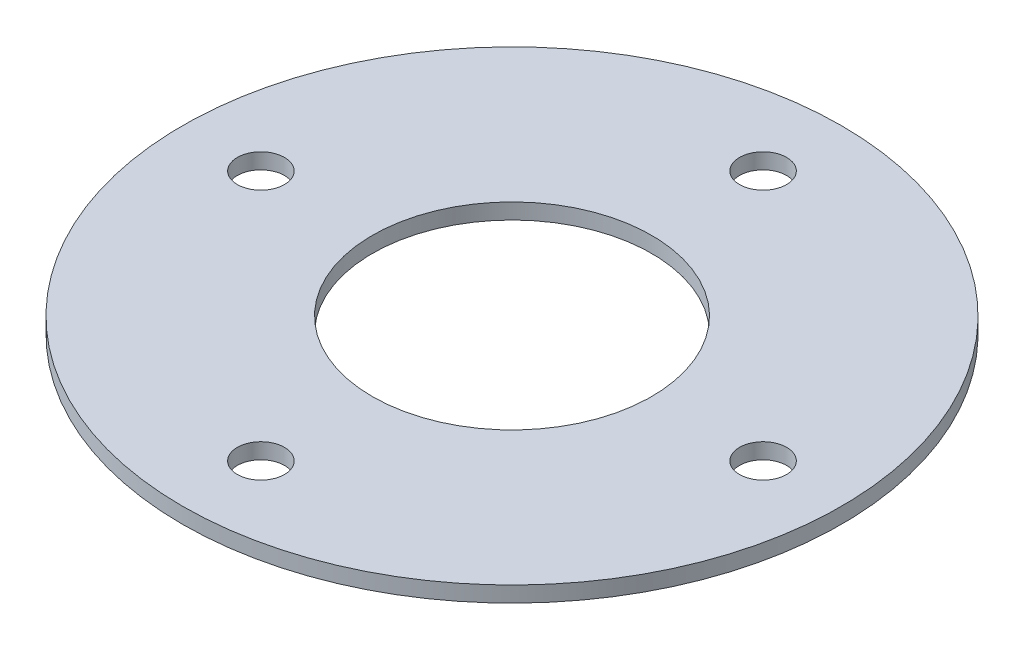
ISO-10303-21;
HEADER;
FILE_DESCRIPTION(('STEP AP214'),'2;1');
FILE_NAME('part.step','',(''),(''),'','','');
FILE_SCHEMA(('AUTOMOTIVE_DESIGN { 1 0 10303 214 1 1 1 1 }'));
ENDSEC;
DATA;
#1=APPLICATION_CONTEXT('core data for automotive mechanical design processes');
#2=APPLICATION_PROTOCOL_DEFINITION('international standard','automotive_design',2000,#1);
#3=PRODUCT_CONTEXT('',#1,'mechanical');
#4=PRODUCT('Part','Part','',(#3));
#5=PRODUCT_RELATED_PRODUCT_CATEGORY('part','',(#4));
#6=PRODUCT_DEFINITION_FORMATION('','',#4);
#7=PRODUCT_DEFINITION_CONTEXT('part definition',#1,'design');
#8=PRODUCT_DEFINITION('design','',#6,#7);
#9=PRODUCT_DEFINITION_SHAPE('','',#8);
#10=(LENGTH_UNIT() NAMED_UNIT(*) SI_UNIT(.MILLI.,.METRE.));
#11=(NAMED_UNIT(*) PLANE_ANGLE_UNIT() SI_UNIT($,.RADIAN.));
#12=(NAMED_UNIT(*) SI_UNIT($,.STERADIAN.) SOLID_ANGLE_UNIT());
#13=UNCERTAINTY_MEASURE_WITH_UNIT(LENGTH_MEASURE(1.E-05),#10,'distance_accuracy_value','');
#14=(GEOMETRIC_REPRESENTATION_CONTEXT(3) GLOBAL_UNCERTAINTY_ASSIGNED_CONTEXT((#13)) GLOBAL_UNIT_ASSIGNED_CONTEXT((#10,
#11,#12)) REPRESENTATION_CONTEXT('',''));
#15=CARTESIAN_POINT('',(0.,0.,0.));
#16=DIRECTION('',(0.,0.,1.));
#17=DIRECTION('',(1.,0.,0.));
#18=AXIS2_PLACEMENT_3D('',#15,#16,#17);
#19=CARTESIAN_POINT('',(0.,1.,0.));
#20=DIRECTION('',(0.,1.,0.));
#21=DIRECTION('',(0.,0.,1.));
#22=AXIS2_PLACEMENT_3D('',#19,#20,#21);
#23=PLANE('',#22);
#24=CARTESIAN_POINT('',(2.16898612446061E-13,1.,15.9999999999992));
#25=DIRECTION('',(0.,1.,0.));
#26=DIRECTION('',(0.,0.,1.));
#27=AXIS2_PLACEMENT_3D('',#24,#25,#26);
#28=CIRCLE('',#27,1.50000000000054);
#29=CARTESIAN_POINT('',(2.16898612446061E-13,1.,17.4999999999998));
#30=VERTEX_POINT('',#29);
#31=EDGE_CURVE('E60',#30,#30,#28,.T.);
#32=ORIENTED_EDGE('',*,*,#31,.F.);
#33=EDGE_LOOP('',(#32));
#34=FACE_BOUND('',#33,.T.);
#35=CARTESIAN_POINT('',(0.,1.,-16.));
#36=DIRECTION('',(0.,1.,0.));
#37=DIRECTION('',(0.,0.,1.));
#38=AXIS2_PLACEMENT_3D('',#35,#36,#37);
#39=CIRCLE('',#38,1.5);
#40=CARTESIAN_POINT('',(0.,1.,-14.5));
#41=VERTEX_POINT('',#40);
#42=EDGE_CURVE('E48',#41,#41,#39,.T.);
#43=ORIENTED_EDGE('',*,*,#42,.F.);
#44=EDGE_LOOP('',(#43));
#45=FACE_BOUND('',#44,.T.);
#46=CARTESIAN_POINT('',(0.,1.,0.));
#47=DIRECTION('',(0.,1.,0.));
#48=DIRECTION('',(0.,0.,1.));
#49=AXIS2_PLACEMENT_3D('',#46,#47,#48);
#50=CIRCLE('',#49,21.);
#51=CARTESIAN_POINT('',(0.,1.,21.));
#52=VERTEX_POINT('',#51);
#53=EDGE_CURVE('E10',#52,#52,#50,.T.);
#54=ORIENTED_EDGE('',*,*,#53,.T.);
#55=EDGE_LOOP('',(#54));
#56=FACE_BOUND('',#55,.T.);
#57=CARTESIAN_POINT('',(0.,1.,0.));
#58=DIRECTION('',(0.,1.,0.));
#59=DIRECTION('',(0.,0.,1.));
#60=AXIS2_PLACEMENT_3D('',#57,#58,#59);
#61=CIRCLE('',#60,8.9);
#62=CARTESIAN_POINT('',(0.,1.,8.9));
#63=VERTEX_POINT('',#62);
#64=EDGE_CURVE('E43',#63,#63,#61,.T.);
#65=ORIENTED_EDGE('',*,*,#64,.F.);
#66=EDGE_LOOP('',(#65));
#67=FACE_BOUND('',#66,.T.);
#68=CARTESIAN_POINT('',(15.9999999999997,1.,-4.83579257706417E-13));
#69=DIRECTION('',(0.,1.,0.));
#70=DIRECTION('',(0.,0.,1.));
#71=AXIS2_PLACEMENT_3D('',#68,#69,#70);
#72=CIRCLE('',#71,1.5000000000006);
#73=CARTESIAN_POINT('',(15.9999999999997,1.,1.50000000000011));
#74=VERTEX_POINT('',#73);
#75=EDGE_CURVE('E54',#74,#74,#72,.T.);
#76=ORIENTED_EDGE('',*,*,#75,.F.);
#77=EDGE_LOOP('',(#76));
#78=FACE_BOUND('',#77,.T.);
#79=CARTESIAN_POINT('',(-15.9999999999995,1.,-2.70800742940835E-13));
#80=DIRECTION('',(0.,1.,0.));
#81=DIRECTION('',(0.,0.,1.));
#82=AXIS2_PLACEMENT_3D('',#79,#80,#81);
#83=CIRCLE('',#82,1.50000000000004);
#84=CARTESIAN_POINT('',(-15.9999999999995,1.,1.49999999999977));
#85=VERTEX_POINT('',#84);
#86=EDGE_CURVE('E66',#85,#85,#83,.T.);
#87=ORIENTED_EDGE('',*,*,#86,.F.);
#88=EDGE_LOOP('',(#87));
#89=FACE_BOUND('',#88,.T.);
#90=ADVANCED_FACE('F32',(#34,#45,#56,#67,#78,#89),#23,.T.);
#91=CARTESIAN_POINT('',(0.,0.,0.));
#92=DIRECTION('',(0.,1.,0.));
#93=DIRECTION('',(0.,0.,1.));
#94=AXIS2_PLACEMENT_3D('',#91,#92,#93);
#95=PLANE('',#94);
#96=CARTESIAN_POINT('',(0.,0.,0.));
#97=DIRECTION('',(0.,1.,0.));
#98=DIRECTION('',(0.,0.,1.));
#99=AXIS2_PLACEMENT_3D('',#96,#97,#98);
#100=CIRCLE('',#99,21.);
#101=CARTESIAN_POINT('',(0.,0.,21.));
#102=VERTEX_POINT('',#101);
#103=EDGE_CURVE('E36',#102,#102,#100,.T.);
#104=ORIENTED_EDGE('',*,*,#103,.F.);
#105=EDGE_LOOP('',(#104));
#106=FACE_BOUND('',#105,.T.);
#107=CARTESIAN_POINT('',(0.,0.,0.));
#108=DIRECTION('',(0.,1.,0.));
#109=DIRECTION('',(0.,0.,1.));
#110=AXIS2_PLACEMENT_3D('',#107,#108,#109);
#111=CIRCLE('',#110,8.9);
#112=CARTESIAN_POINT('',(0.,0.,8.9));
#113=VERTEX_POINT('',#112);
#114=EDGE_CURVE('E45',#113,#113,#111,.T.);
#115=ORIENTED_EDGE('',*,*,#114,.T.);
#116=EDGE_LOOP('',(#115));
#117=FACE_BOUND('',#116,.T.);
#118=CARTESIAN_POINT('',(0.,0.,-16.));
#119=DIRECTION('',(0.,1.,0.));
#120=DIRECTION('',(0.,0.,1.));
#121=AXIS2_PLACEMENT_3D('',#118,#119,#120);
#122=CIRCLE('',#121,1.5);
#123=CARTESIAN_POINT('',(0.,0.,-14.5));
#124=VERTEX_POINT('',#123);
#125=EDGE_CURVE('E51',#124,#124,#122,.T.);
#126=ORIENTED_EDGE('',*,*,#125,.T.);
#127=EDGE_LOOP('',(#126));
#128=FACE_BOUND('',#127,.T.);
#129=CARTESIAN_POINT('',(15.9999999999997,0.,-4.83579257706417E-13));
#130=DIRECTION('',(0.,1.,0.));
#131=DIRECTION('',(0.,0.,1.));
#132=AXIS2_PLACEMENT_3D('',#129,#130,#131);
#133=CIRCLE('',#132,1.5000000000006);
#134=CARTESIAN_POINT('',(15.9999999999997,0.,1.50000000000011));
#135=VERTEX_POINT('',#134);
#136=EDGE_CURVE('E57',#135,#135,#133,.T.);
#137=ORIENTED_EDGE('',*,*,#136,.T.);
#138=EDGE_LOOP('',(#137));
#139=FACE_BOUND('',#138,.T.);
#140=CARTESIAN_POINT('',(2.16898612446061E-13,0.,15.9999999999992));
#141=DIRECTION('',(0.,1.,0.));
#142=DIRECTION('',(0.,0.,1.));
#143=AXIS2_PLACEMENT_3D('',#140,#141,#142);
#144=CIRCLE('',#143,1.50000000000054);
#145=CARTESIAN_POINT('',(2.16898612446061E-13,0.,17.4999999999998));
#146=VERTEX_POINT('',#145);
#147=EDGE_CURVE('E63',#146,#146,#144,.T.);
#148=ORIENTED_EDGE('',*,*,#147,.T.);
#149=EDGE_LOOP('',(#148));
#150=FACE_BOUND('',#149,.T.);
#151=CARTESIAN_POINT('',(-15.9999999999995,0.,-2.70800742940835E-13));
#152=DIRECTION('',(0.,1.,0.));
#153=DIRECTION('',(0.,0.,1.));
#154=AXIS2_PLACEMENT_3D('',#151,#152,#153);
#155=CIRCLE('',#154,1.50000000000004);
#156=CARTESIAN_POINT('',(-15.9999999999995,0.,1.49999999999977));
#157=VERTEX_POINT('',#156);
#158=EDGE_CURVE('E69',#157,#157,#155,.T.);
#159=ORIENTED_EDGE('',*,*,#158,.T.);
#160=EDGE_LOOP('',(#159));
#161=FACE_BOUND('',#160,.T.);
#162=ADVANCED_FACE('F79',(#106,#117,#128,#139,#150,#161),#95,.F.);
#163=CARTESIAN_POINT('',(0.,1.,0.));
#164=DIRECTION('',(0.,-1.,0.));
#165=DIRECTION('',(0.,0.,-1.));
#166=AXIS2_PLACEMENT_3D('',#163,#164,#165);
#167=CYLINDRICAL_SURFACE('',#166,21.);
#168=ORIENTED_EDGE('',*,*,#53,.F.);
#169=EDGE_LOOP('',(#168));
#170=FACE_BOUND('',#169,.T.);
#171=ORIENTED_EDGE('',*,*,#103,.T.);
#172=EDGE_LOOP('',(#171));
#173=FACE_BOUND('',#172,.T.);
#174=ADVANCED_FACE('F34',(#170,#173),#167,.T.);
#175=CARTESIAN_POINT('',(0.,1.,0.));
#176=DIRECTION('',(0.,-1.,0.));
#177=DIRECTION('',(0.,0.,-1.));
#178=AXIS2_PLACEMENT_3D('',#175,#176,#177);
#179=CYLINDRICAL_SURFACE('',#178,8.9);
#180=ORIENTED_EDGE('',*,*,#64,.T.);
#181=EDGE_LOOP('',(#180));
#182=FACE_BOUND('',#181,.T.);
#183=ORIENTED_EDGE('',*,*,#114,.F.);
#184=EDGE_LOOP('',(#183));
#185=FACE_BOUND('',#184,.T.);
#186=ADVANCED_FACE('F89',(#182,#185),#179,.F.);
#187=CARTESIAN_POINT('',(0.,1.,-16.));
#188=DIRECTION('',(0.,-1.,0.));
#189=DIRECTION('',(0.,0.,-1.));
#190=AXIS2_PLACEMENT_3D('',#187,#188,#189);
#191=CYLINDRICAL_SURFACE('',#190,1.5);
#192=ORIENTED_EDGE('',*,*,#42,.T.);
#193=EDGE_LOOP('',(#192));
#194=FACE_BOUND('',#193,.T.);
#195=ORIENTED_EDGE('',*,*,#125,.F.);
#196=EDGE_LOOP('',(#195));
#197=FACE_BOUND('',#196,.T.);
#198=ADVANCED_FACE('F92',(#194,#197),#191,.F.);
#199=CARTESIAN_POINT('',(15.9999999999997,1.,-4.83579257706417E-13));
#200=DIRECTION('',(0.,-1.,0.));
#201=DIRECTION('',(0.,0.,-1.));
#202=AXIS2_PLACEMENT_3D('',#199,#200,#201);
#203=CYLINDRICAL_SURFACE('',#202,1.5000000000006);
#204=ORIENTED_EDGE('',*,*,#75,.T.);
#205=EDGE_LOOP('',(#204));
#206=FACE_BOUND('',#205,.T.);
#207=ORIENTED_EDGE('',*,*,#136,.F.);
#208=EDGE_LOOP('',(#207));
#209=FACE_BOUND('',#208,.T.);
#210=ADVANCED_FACE('F96',(#206,#209),#203,.F.);
#211=CARTESIAN_POINT('',(2.16898612446061E-13,1.,15.9999999999992));
#212=DIRECTION('',(0.,-1.,0.));
#213=DIRECTION('',(0.,0.,-1.));
#214=AXIS2_PLACEMENT_3D('',#211,#212,#213);
#215=CYLINDRICAL_SURFACE('',#214,1.50000000000054);
#216=ORIENTED_EDGE('',*,*,#31,.T.);
#217=EDGE_LOOP('',(#216));
#218=FACE_BOUND('',#217,.T.);
#219=ORIENTED_EDGE('',*,*,#147,.F.);
#220=EDGE_LOOP('',(#219));
#221=FACE_BOUND('',#220,.T.);
#222=ADVANCED_FACE('F100',(#218,#221),#215,.F.);
#223=CARTESIAN_POINT('',(-15.9999999999995,1.,-2.70800742940835E-13));
#224=DIRECTION('',(0.,-1.,0.));
#225=DIRECTION('',(0.,0.,-1.));
#226=AXIS2_PLACEMENT_3D('',#223,#224,#225);
#227=CYLINDRICAL_SURFACE('',#226,1.50000000000004);
#228=ORIENTED_EDGE('',*,*,#86,.T.);
#229=EDGE_LOOP('',(#228));
#230=FACE_BOUND('',#229,.T.);
#231=ORIENTED_EDGE('',*,*,#158,.F.);
#232=EDGE_LOOP('',(#231));
#233=FACE_BOUND('',#232,.T.);
#234=ADVANCED_FACE('F75',(#230,#233),#227,.F.);
#235=CLOSED_SHELL('',(#90,#162,#174,#186,#198,#210,#222,#234));
#236=MANIFOLD_SOLID_BREP('B2',#235);
#237=ADVANCED_BREP_SHAPE_REPRESENTATION('',(#18,#236),#14);
#238=SHAPE_DEFINITION_REPRESENTATION(#9,#237);
ENDSEC;
END-ISO-10303-21;
